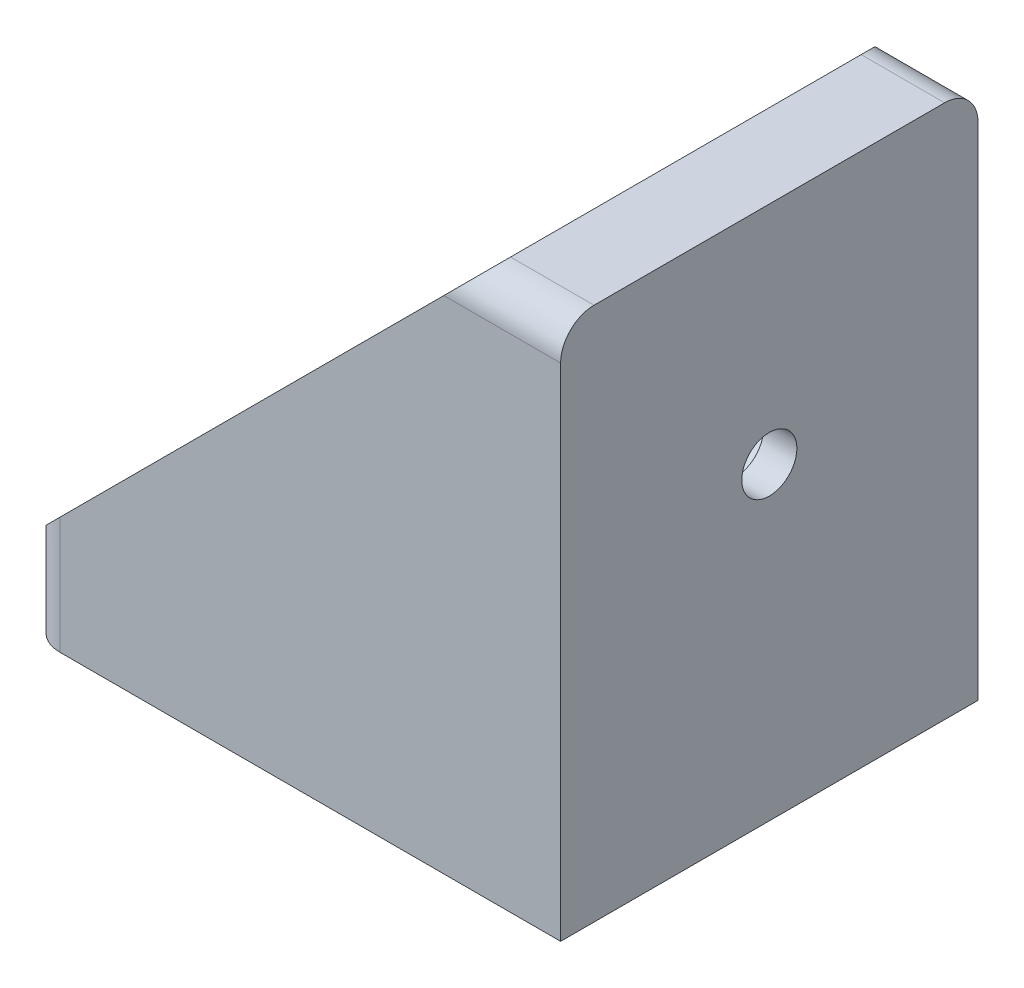
ISO-10303-21;
HEADER;
FILE_DESCRIPTION(('STEP AP214'),'2;1');
FILE_NAME('part.step','',(''),(''),'','','');
FILE_SCHEMA(('AUTOMOTIVE_DESIGN { 1 0 10303 214 1 1 1 1 }'));
ENDSEC;
DATA;
#1=APPLICATION_CONTEXT('core data for automotive mechanical design processes');
#2=APPLICATION_PROTOCOL_DEFINITION('international standard','automotive_design',2000,#1);
#3=PRODUCT_CONTEXT('',#1,'mechanical');
#4=PRODUCT('Part','Part','',(#3));
#5=PRODUCT_RELATED_PRODUCT_CATEGORY('part','',(#4));
#6=PRODUCT_DEFINITION_FORMATION('','',#4);
#7=PRODUCT_DEFINITION_CONTEXT('part definition',#1,'design');
#8=PRODUCT_DEFINITION('design','',#6,#7);
#9=PRODUCT_DEFINITION_SHAPE('','',#8);
#10=(LENGTH_UNIT() NAMED_UNIT(*) SI_UNIT(.MILLI.,.METRE.));
#11=(NAMED_UNIT(*) PLANE_ANGLE_UNIT() SI_UNIT($,.RADIAN.));
#12=(NAMED_UNIT(*) SI_UNIT($,.STERADIAN.) SOLID_ANGLE_UNIT());
#13=UNCERTAINTY_MEASURE_WITH_UNIT(LENGTH_MEASURE(1.E-05),#10,'distance_accuracy_value','');
#14=(GEOMETRIC_REPRESENTATION_CONTEXT(3) GLOBAL_UNCERTAINTY_ASSIGNED_CONTEXT((#13)) GLOBAL_UNIT_ASSIGNED_CONTEXT((#10,
#11,#12)) REPRESENTATION_CONTEXT('',''));
#15=CARTESIAN_POINT('',(0.,0.,0.));
#16=DIRECTION('',(0.,0.,1.));
#17=DIRECTION('',(1.,0.,0.));
#18=AXIS2_PLACEMENT_3D('',#15,#16,#17);
#19=CARTESIAN_POINT('',(-5.,5.,25.));
#20=DIRECTION('',(1.,0.,0.));
#21=DIRECTION('',(0.,1.,0.));
#22=AXIS2_PLACEMENT_3D('',#19,#20,#21);
#23=PLANE('',#22);
#24=DIRECTION('',(0.,0.5,0.866025403784438));
#25=VECTOR('',#24,1.);
#26=CARTESIAN_POINT('',(-5.,15.0358983848622,12.5));
#27=LINE('',#26,#25);
#28=CARTESIAN_POINT('',(-5.,15.0358983848622,12.5));
#29=VERTEX_POINT('',#28);
#30=CARTESIAN_POINT('',(-5.,16.7679491924311,15.5));
#31=VERTEX_POINT('',#30);
#32=EDGE_CURVE('E240',#29,#31,#27,.T.);
#33=ORIENTED_EDGE('',*,*,#32,.F.);
#34=DIRECTION('',(0.,-0.5,0.866025403784439));
#35=VECTOR('',#34,1.);
#36=CARTESIAN_POINT('',(-5.,16.7679491924311,9.5));
#37=LINE('',#36,#35);
#38=CARTESIAN_POINT('',(-5.,16.7679491924311,9.5));
#39=VERTEX_POINT('',#38);
#40=EDGE_CURVE('E57',#39,#29,#37,.T.);
#41=ORIENTED_EDGE('',*,*,#40,.F.);
#42=DIRECTION('',(0.,-1.,0.));
#43=VECTOR('',#42,1.);
#44=CARTESIAN_POINT('',(-5.,20.2320508075689,9.5));
#45=LINE('',#44,#43);
#46=CARTESIAN_POINT('',(-5.,20.2320508075689,9.5));
#47=VERTEX_POINT('',#46);
#48=EDGE_CURVE('E223',#47,#39,#45,.T.);
#49=ORIENTED_EDGE('',*,*,#48,.F.);
#50=DIRECTION('',(0.,-0.5,-0.866025403784438));
#51=VECTOR('',#50,1.);
#52=CARTESIAN_POINT('',(-5.,21.9641016151378,12.5));
#53=LINE('',#52,#51);
#54=CARTESIAN_POINT('',(-5.,21.9641016151378,12.5));
#55=VERTEX_POINT('',#54);
#56=EDGE_CURVE('E226',#55,#47,#53,.T.);
#57=ORIENTED_EDGE('',*,*,#56,.F.);
#58=DIRECTION('',(0.,0.5,-0.866025403784439));
#59=VECTOR('',#58,1.);
#60=CARTESIAN_POINT('',(-5.,20.2320508075689,15.5));
#61=LINE('',#60,#59);
#62=CARTESIAN_POINT('',(-5.,20.2320508075689,15.5));
#63=VERTEX_POINT('',#62);
#64=EDGE_CURVE('E246',#63,#55,#61,.T.);
#65=ORIENTED_EDGE('',*,*,#64,.F.);
#66=DIRECTION('',(0.,1.,0.));
#67=VECTOR('',#66,1.);
#68=CARTESIAN_POINT('',(-5.,16.7679491924311,15.5));
#69=LINE('',#68,#67);
#70=EDGE_CURVE('E243',#31,#63,#69,.T.);
#71=ORIENTED_EDGE('',*,*,#70,.F.);
#72=EDGE_LOOP('',(#33,#41,#49,#57,#65,#71));
#73=FACE_BOUND('',#72,.T.);
#74=DIRECTION('',(0.,1.,0.));
#75=VECTOR('',#74,1.);
#76=CARTESIAN_POINT('',(-5.,5.,3.));
#77=LINE('',#76,#75);
#78=CARTESIAN_POINT('',(-5.,5.,3.));
#79=VERTEX_POINT('',#78);
#80=CARTESIAN_POINT('',(-5.,32.,3.));
#81=VERTEX_POINT('',#80);
#82=EDGE_CURVE('E320',#79,#81,#77,.T.);
#83=ORIENTED_EDGE('',*,*,#82,.F.);
#84=DIRECTION('',(0.,0.,-1.));
#85=VECTOR('',#84,1.);
#86=CARTESIAN_POINT('',(-5.,5.,25.));
#87=LINE('',#86,#85);
#88=CARTESIAN_POINT('',(-5.,5.,22.));
#89=VERTEX_POINT('',#88);
#90=EDGE_CURVE('E353',#89,#79,#87,.T.);
#91=ORIENTED_EDGE('',*,*,#90,.F.);
#92=DIRECTION('',(0.,-1.,0.));
#93=VECTOR('',#92,1.);
#94=CARTESIAN_POINT('',(-5.,5.,22.));
#95=LINE('',#94,#93);
#96=CARTESIAN_POINT('',(-5.,32.,22.));
#97=VERTEX_POINT('',#96);
#98=EDGE_CURVE('E332',#97,#89,#95,.T.);
#99=ORIENTED_EDGE('',*,*,#98,.F.);
#100=DIRECTION('',(0.,0.,-1.));
#101=VECTOR('',#100,1.);
#102=CARTESIAN_POINT('',(-5.,32.,25.));
#103=LINE('',#102,#101);
#104=EDGE_CURVE('E356',#97,#81,#103,.T.);
#105=ORIENTED_EDGE('',*,*,#104,.T.);
#106=EDGE_LOOP('',(#83,#91,#99,#105));
#107=FACE_BOUND('',#106,.T.);
#108=ADVANCED_FACE('F40',(#73,#107),#23,.F.);
#109=CARTESIAN_POINT('',(-32.,5.,25.));
#110=DIRECTION('',(0.,-1.,0.));
#111=DIRECTION('',(0.,0.,-1.));
#112=AXIS2_PLACEMENT_3D('',#109,#110,#111);
#113=PLANE('',#112);
#114=DIRECTION('',(-0.5,0.,-0.866025403784438));
#115=VECTOR('',#114,1.);
#116=CARTESIAN_POINT('',(-15.0358983848622,5.,12.5));
#117=LINE('',#116,#115);
#118=CARTESIAN_POINT('',(-15.0358983848622,5.,12.5));
#119=VERTEX_POINT('',#118);
#120=CARTESIAN_POINT('',(-16.7679491924311,5.,9.5));
#121=VERTEX_POINT('',#120);
#122=EDGE_CURVE('E281',#119,#121,#117,.T.);
#123=ORIENTED_EDGE('',*,*,#122,.F.);
#124=DIRECTION('',(0.5,0.,-0.866025403784439));
#125=VECTOR('',#124,1.);
#126=CARTESIAN_POINT('',(-16.7679491924311,5.,15.5));
#127=LINE('',#126,#125);
#128=CARTESIAN_POINT('',(-16.7679491924311,5.,15.5));
#129=VERTEX_POINT('',#128);
#130=EDGE_CURVE('E65',#129,#119,#127,.T.);
#131=ORIENTED_EDGE('',*,*,#130,.F.);
#132=DIRECTION('',(1.,0.,0.));
#133=VECTOR('',#132,1.);
#134=CARTESIAN_POINT('',(-20.2320508075689,5.,15.5));
#135=LINE('',#134,#133);
#136=CARTESIAN_POINT('',(-20.2320508075689,5.,15.5));
#137=VERTEX_POINT('',#136);
#138=EDGE_CURVE('E264',#137,#129,#135,.T.);
#139=ORIENTED_EDGE('',*,*,#138,.F.);
#140=DIRECTION('',(0.5,0.,0.866025403784438));
#141=VECTOR('',#140,1.);
#142=CARTESIAN_POINT('',(-21.9641016151377,5.,12.5));
#143=LINE('',#142,#141);
#144=CARTESIAN_POINT('',(-21.9641016151377,5.,12.5));
#145=VERTEX_POINT('',#144);
#146=EDGE_CURVE('E290',#145,#137,#143,.T.);
#147=ORIENTED_EDGE('',*,*,#146,.F.);
#148=DIRECTION('',(-0.5,0.,0.866025403784438));
#149=VECTOR('',#148,1.);
#150=CARTESIAN_POINT('',(-20.2320508075689,5.,9.5));
#151=LINE('',#150,#149);
#152=CARTESIAN_POINT('',(-20.2320508075689,5.,9.5));
#153=VERTEX_POINT('',#152);
#154=EDGE_CURVE('E287',#153,#145,#151,.T.);
#155=ORIENTED_EDGE('',*,*,#154,.F.);
#156=DIRECTION('',(-1.,0.,0.));
#157=VECTOR('',#156,1.);
#158=CARTESIAN_POINT('',(-16.7679491924311,5.,9.5));
#159=LINE('',#158,#157);
#160=EDGE_CURVE('E284',#121,#153,#159,.T.);
#161=ORIENTED_EDGE('',*,*,#160,.F.);
#162=EDGE_LOOP('',(#123,#131,#139,#147,#155,#161));
#163=FACE_BOUND('',#162,.T.);
#164=DIRECTION('',(1.,0.,0.));
#165=VECTOR('',#164,1.);
#166=CARTESIAN_POINT('',(-32.,5.,3.));
#167=LINE('',#166,#165);
#168=CARTESIAN_POINT('',(-32.,5.,3.));
#169=VERTEX_POINT('',#168);
#170=EDGE_CURVE('E317',#169,#79,#167,.T.);
#171=ORIENTED_EDGE('',*,*,#170,.F.);
#172=DIRECTION('',(0.,0.,-1.));
#173=VECTOR('',#172,1.);
#174=CARTESIAN_POINT('',(-32.,5.,25.));
#175=LINE('',#174,#173);
#176=CARTESIAN_POINT('',(-32.,5.,22.));
#177=VERTEX_POINT('',#176);
#178=EDGE_CURVE('E350',#177,#169,#175,.T.);
#179=ORIENTED_EDGE('',*,*,#178,.F.);
#180=DIRECTION('',(-1.,0.,0.));
#181=VECTOR('',#180,1.);
#182=CARTESIAN_POINT('',(-32.,5.,22.));
#183=LINE('',#182,#181);
#184=EDGE_CURVE('E327',#89,#177,#183,.T.);
#185=ORIENTED_EDGE('',*,*,#184,.F.);
#186=ORIENTED_EDGE('',*,*,#90,.T.);
#187=EDGE_LOOP('',(#171,#179,#185,#186));
#188=FACE_BOUND('',#187,.T.);
#189=ADVANCED_FACE('F437',(#163,#188),#113,.F.);
#190=CARTESIAN_POINT('',(0.,32.,25.));
#191=DIRECTION('',(-1.,0.,0.));
#192=DIRECTION('',(0.,0.,1.));
#193=AXIS2_PLACEMENT_3D('',#190,#191,#192);
#194=PLANE('',#193);
#195=CARTESIAN_POINT('',(0.,18.5,12.5));
#196=DIRECTION('',(-1.,0.,0.));
#197=DIRECTION('',(0.,0.,1.));
#198=AXIS2_PLACEMENT_3D('',#195,#196,#197);
#199=CIRCLE('',#198,1.65);
#200=CARTESIAN_POINT('',(0.,18.5,14.15));
#201=VERTEX_POINT('',#200);
#202=EDGE_CURVE('E241',#201,#201,#199,.T.);
#203=ORIENTED_EDGE('',*,*,#202,.T.);
#204=EDGE_LOOP('',(#203));
#205=FACE_BOUND('',#204,.T.);
#206=DIRECTION('',(0.,1.,0.));
#207=VECTOR('',#206,1.);
#208=CARTESIAN_POINT('',(0.,32.,0.));
#209=LINE('',#208,#207);
#210=CARTESIAN_POINT('',(0.,0.,0.));
#211=VERTEX_POINT('',#210);
#212=CARTESIAN_POINT('',(0.,30.,0.));
#213=VERTEX_POINT('',#212);
#214=EDGE_CURVE('E334',#211,#213,#209,.T.);
#215=ORIENTED_EDGE('',*,*,#214,.T.);
#216=CARTESIAN_POINT('',(0.,30.,2.));
#217=DIRECTION('',(-1.,0.,0.));
#218=DIRECTION('',(0.,0.,1.));
#219=AXIS2_PLACEMENT_3D('',#216,#217,#218);
#220=CIRCLE('',#219,2.);
#221=CARTESIAN_POINT('',(0.,32.,2.));
#222=VERTEX_POINT('',#221);
#223=EDGE_CURVE('E377',#213,#222,#220,.F.);
#224=ORIENTED_EDGE('',*,*,#223,.T.);
#225=DIRECTION('',(0.,0.,-1.));
#226=VECTOR('',#225,1.);
#227=CARTESIAN_POINT('',(0.,32.,25.));
#228=LINE('',#227,#226);
#229=CARTESIAN_POINT('',(0.,32.,23.));
#230=VERTEX_POINT('',#229);
#231=EDGE_CURVE('E359',#230,#222,#228,.T.);
#232=ORIENTED_EDGE('',*,*,#231,.F.);
#233=CARTESIAN_POINT('',(0.,30.,23.));
#234=DIRECTION('',(-1.,0.,0.));
#235=DIRECTION('',(0.,0.,1.));
#236=AXIS2_PLACEMENT_3D('',#233,#234,#235);
#237=CIRCLE('',#236,2.);
#238=CARTESIAN_POINT('',(0.,30.,25.));
#239=VERTEX_POINT('',#238);
#240=EDGE_CURVE('E375',#230,#239,#237,.F.);
#241=ORIENTED_EDGE('',*,*,#240,.T.);
#242=DIRECTION('',(0.,1.,0.));
#243=VECTOR('',#242,1.);
#244=CARTESIAN_POINT('',(0.,32.,25.));
#245=LINE('',#244,#243);
#246=CARTESIAN_POINT('',(0.,0.,25.));
#247=VERTEX_POINT('',#246);
#248=EDGE_CURVE('E335',#247,#239,#245,.T.);
#249=ORIENTED_EDGE('',*,*,#248,.F.);
#250=DIRECTION('',(0.,0.,-1.));
#251=VECTOR('',#250,1.);
#252=CARTESIAN_POINT('',(0.,0.,25.));
#253=LINE('',#252,#251);
#254=EDGE_CURVE('E341',#247,#211,#253,.T.);
#255=ORIENTED_EDGE('',*,*,#254,.T.);
#256=EDGE_LOOP('',(#215,#224,#232,#241,#249,#255));
#257=FACE_BOUND('',#256,.T.);
#258=ADVANCED_FACE('F440',(#205,#257),#194,.F.);
#259=CARTESIAN_POINT('',(-5.,32.,25.));
#260=DIRECTION('',(0.,-1.,0.));
#261=DIRECTION('',(0.,0.,-1.));
#262=AXIS2_PLACEMENT_3D('',#259,#260,#261);
#263=PLANE('',#262);
#264=ORIENTED_EDGE('',*,*,#231,.T.);
#265=DIRECTION('',(-1.,0.,0.));
#266=VECTOR('',#265,1.);
#267=CARTESIAN_POINT('',(-5.,32.,2.));
#268=LINE('',#267,#266);
#269=CARTESIAN_POINT('',(-5.,32.,2.));
#270=VERTEX_POINT('',#269);
#271=EDGE_CURVE('E364',#222,#270,#268,.T.);
#272=ORIENTED_EDGE('',*,*,#271,.T.);
#273=DIRECTION('',(0.,0.,-1.));
#274=VECTOR('',#273,1.);
#275=CARTESIAN_POINT('',(-5.,32.,25.));
#276=LINE('',#275,#274);
#277=EDGE_CURVE('E314',#81,#270,#276,.T.);
#278=ORIENTED_EDGE('',*,*,#277,.F.);
#279=ORIENTED_EDGE('',*,*,#104,.F.);
#280=CARTESIAN_POINT('',(-5.,32.,23.));
#281=VERTEX_POINT('',#280);
#282=EDGE_CURVE('E357',#281,#97,#103,.T.);
#283=ORIENTED_EDGE('',*,*,#282,.F.);
#284=DIRECTION('',(-1.,0.,0.));
#285=VECTOR('',#284,1.);
#286=CARTESIAN_POINT('',(-5.,32.,23.));
#287=LINE('',#286,#285);
#288=EDGE_CURVE('E362',#281,#230,#287,.F.);
#289=ORIENTED_EDGE('',*,*,#288,.T.);
#290=EDGE_LOOP('',(#264,#272,#278,#279,#283,#289));
#291=FACE_BOUND('',#290,.T.);
#292=ADVANCED_FACE('F487',(#291),#263,.F.);
#293=CARTESIAN_POINT('',(-32.,0.,25.));
#294=DIRECTION('',(1.,0.,0.));
#295=DIRECTION('',(0.,0.,-1.));
#296=AXIS2_PLACEMENT_3D('',#293,#294,#295);
#297=PLANE('',#296);
#298=DIRECTION('',(0.,0.,1.));
#299=VECTOR('',#298,1.);
#300=CARTESIAN_POINT('',(-32.,5.,25.));
#301=LINE('',#300,#299);
#302=CARTESIAN_POINT('',(-32.,5.,2.));
#303=VERTEX_POINT('',#302);
#304=EDGE_CURVE('E310',#303,#169,#301,.T.);
#305=ORIENTED_EDGE('',*,*,#304,.F.);
#306=DIRECTION('',(0.,-1.,0.));
#307=VECTOR('',#306,1.);
#308=CARTESIAN_POINT('',(-32.,0.,2.));
#309=LINE('',#308,#307);
#310=CARTESIAN_POINT('',(-32.,0.,2.));
#311=VERTEX_POINT('',#310);
#312=EDGE_CURVE('E391',#303,#311,#309,.T.);
#313=ORIENTED_EDGE('',*,*,#312,.T.);
#314=DIRECTION('',(0.,0.,-1.));
#315=VECTOR('',#314,1.);
#316=CARTESIAN_POINT('',(-32.,0.,25.));
#317=LINE('',#316,#315);
#318=CARTESIAN_POINT('',(-32.,0.,23.));
#319=VERTEX_POINT('',#318);
#320=EDGE_CURVE('E347',#319,#311,#317,.T.);
#321=ORIENTED_EDGE('',*,*,#320,.F.);
#322=DIRECTION('',(0.,-1.,0.));
#323=VECTOR('',#322,1.);
#324=CARTESIAN_POINT('',(-32.,0.,23.));
#325=LINE('',#324,#323);
#326=CARTESIAN_POINT('',(-32.,5.,23.));
#327=VERTEX_POINT('',#326);
#328=EDGE_CURVE('E389',#319,#327,#325,.F.);
#329=ORIENTED_EDGE('',*,*,#328,.T.);
#330=EDGE_CURVE('E351',#327,#177,#175,.T.);
#331=ORIENTED_EDGE('',*,*,#330,.T.);
#332=ORIENTED_EDGE('',*,*,#178,.T.);
#333=EDGE_LOOP('',(#305,#313,#321,#329,#331,#332));
#334=FACE_BOUND('',#333,.T.);
#335=ADVANCED_FACE('F451',(#334),#297,.F.);
#336=CARTESIAN_POINT('',(0.,0.,25.));
#337=DIRECTION('',(0.,1.,0.));
#338=DIRECTION('',(-1.,0.,0.));
#339=AXIS2_PLACEMENT_3D('',#336,#337,#338);
#340=PLANE('',#339);
#341=CARTESIAN_POINT('',(-18.5,0.,12.5));
#342=DIRECTION('',(0.,1.,0.));
#343=DIRECTION('',(-1.,0.,0.));
#344=AXIS2_PLACEMENT_3D('',#341,#342,#343);
#345=CIRCLE('',#344,1.65);
#346=CARTESIAN_POINT('',(-20.15,0.,12.5));
#347=VERTEX_POINT('',#346);
#348=EDGE_CURVE('E44',#347,#347,#345,.T.);
#349=ORIENTED_EDGE('',*,*,#348,.T.);
#350=EDGE_LOOP('',(#349));
#351=FACE_BOUND('',#350,.T.);
#352=ORIENTED_EDGE('',*,*,#320,.T.);
#353=CARTESIAN_POINT('',(-30.,0.,2.));
#354=DIRECTION('',(0.,1.,0.));
#355=DIRECTION('',(-1.,0.,0.));
#356=AXIS2_PLACEMENT_3D('',#353,#354,#355);
#357=CIRCLE('',#356,2.);
#358=CARTESIAN_POINT('',(-30.,0.,0.));
#359=VERTEX_POINT('',#358);
#360=EDGE_CURVE('E11',#311,#359,#357,.F.);
#361=ORIENTED_EDGE('',*,*,#360,.T.);
#362=DIRECTION('',(1.,0.,0.));
#363=VECTOR('',#362,1.);
#364=CARTESIAN_POINT('',(0.,0.,0.));
#365=LINE('',#364,#363);
#366=EDGE_CURVE('E339',#359,#211,#365,.T.);
#367=ORIENTED_EDGE('',*,*,#366,.T.);
#368=ORIENTED_EDGE('',*,*,#254,.F.);
#369=DIRECTION('',(1.,0.,0.));
#370=VECTOR('',#369,1.);
#371=CARTESIAN_POINT('',(0.,0.,25.));
#372=LINE('',#371,#370);
#373=CARTESIAN_POINT('',(-30.,0.,25.));
#374=VERTEX_POINT('',#373);
#375=EDGE_CURVE('E338',#374,#247,#372,.T.);
#376=ORIENTED_EDGE('',*,*,#375,.F.);
#377=CARTESIAN_POINT('',(-30.,0.,23.));
#378=DIRECTION('',(0.,1.,0.));
#379=DIRECTION('',(-1.,0.,0.));
#380=AXIS2_PLACEMENT_3D('',#377,#378,#379);
#381=CIRCLE('',#380,2.);
#382=EDGE_CURVE('E49',#374,#319,#381,.F.);
#383=ORIENTED_EDGE('',*,*,#382,.T.);
#384=EDGE_LOOP('',(#352,#361,#367,#368,#376,#383));
#385=FACE_BOUND('',#384,.T.);
#386=ADVANCED_FACE('F465',(#351,#385),#340,.F.);
#387=CARTESIAN_POINT('',(0.,0.,25.));
#388=DIRECTION('',(0.,0.,-1.));
#389=DIRECTION('',(-1.,0.,0.));
#390=AXIS2_PLACEMENT_3D('',#387,#388,#389);
#391=PLANE('',#390);
#392=ORIENTED_EDGE('',*,*,#248,.T.);
#393=DIRECTION('',(-1.,0.,0.));
#394=VECTOR('',#393,1.);
#395=CARTESIAN_POINT('',(0.,30.,25.));
#396=LINE('',#395,#394);
#397=CARTESIAN_POINT('',(-7.,30.,25.));
#398=VERTEX_POINT('',#397);
#399=EDGE_CURVE('E382',#239,#398,#396,.T.);
#400=ORIENTED_EDGE('',*,*,#399,.T.);
#401=DIRECTION('',(0.707106781186547,0.707106781186548,0.));
#402=VECTOR('',#401,1.);
#403=CARTESIAN_POINT('',(-32.,5.,25.));
#404=LINE('',#403,#402);
#405=CARTESIAN_POINT('',(-30.,7.,25.));
#406=VERTEX_POINT('',#405);
#407=EDGE_CURVE('E324',#406,#398,#404,.T.);
#408=ORIENTED_EDGE('',*,*,#407,.F.);
#409=DIRECTION('',(0.,-1.,0.));
#410=VECTOR('',#409,1.);
#411=CARTESIAN_POINT('',(-30.,0.,25.));
#412=LINE('',#411,#410);
#413=EDGE_CURVE('E379',#406,#374,#412,.T.);
#414=ORIENTED_EDGE('',*,*,#413,.T.);
#415=ORIENTED_EDGE('',*,*,#375,.T.);
#416=EDGE_LOOP('',(#392,#400,#408,#414,#415));
#417=FACE_BOUND('',#416,.T.);
#418=ADVANCED_FACE('F474',(#417),#391,.F.);
#419=CARTESIAN_POINT('',(0.,0.,0.));
#420=DIRECTION('',(0.,0.,-1.));
#421=DIRECTION('',(-1.,0.,0.));
#422=AXIS2_PLACEMENT_3D('',#419,#420,#421);
#423=PLANE('',#422);
#424=DIRECTION('',(0.707106781186547,0.707106781186548,0.));
#425=VECTOR('',#424,1.);
#426=CARTESIAN_POINT('',(-32.,5.,0.));
#427=LINE('',#426,#425);
#428=CARTESIAN_POINT('',(-30.,7.,0.));
#429=VERTEX_POINT('',#428);
#430=CARTESIAN_POINT('',(-7.,30.,0.));
#431=VERTEX_POINT('',#430);
#432=EDGE_CURVE('E307',#429,#431,#427,.T.);
#433=ORIENTED_EDGE('',*,*,#432,.T.);
#434=DIRECTION('',(-1.,0.,0.));
#435=VECTOR('',#434,1.);
#436=CARTESIAN_POINT('',(0.,30.,0.));
#437=LINE('',#436,#435);
#438=EDGE_CURVE('E373',#431,#213,#437,.F.);
#439=ORIENTED_EDGE('',*,*,#438,.T.);
#440=ORIENTED_EDGE('',*,*,#214,.F.);
#441=ORIENTED_EDGE('',*,*,#366,.F.);
#442=DIRECTION('',(0.,-1.,0.));
#443=VECTOR('',#442,1.);
#444=CARTESIAN_POINT('',(-30.,5.,0.));
#445=LINE('',#444,#443);
#446=EDGE_CURVE('E371',#359,#429,#445,.F.);
#447=ORIENTED_EDGE('',*,*,#446,.T.);
#448=EDGE_LOOP('',(#433,#439,#440,#441,#447));
#449=FACE_BOUND('',#448,.T.);
#450=ADVANCED_FACE('F496',(#449),#423,.T.);
#451=CARTESIAN_POINT('',(-16.,16.,22.));
#452=DIRECTION('',(0.,0.,1.));
#453=DIRECTION('',(1.,0.,0.));
#454=AXIS2_PLACEMENT_3D('',#451,#452,#453);
#455=PLANE('',#454);
#456=DIRECTION('',(0.707106781186547,0.707106781186548,0.));
#457=VECTOR('',#456,1.);
#458=CARTESIAN_POINT('',(-32.,5.,22.));
#459=LINE('',#458,#457);
#460=EDGE_CURVE('E323',#177,#97,#459,.T.);
#461=ORIENTED_EDGE('',*,*,#460,.T.);
#462=ORIENTED_EDGE('',*,*,#98,.T.);
#463=ORIENTED_EDGE('',*,*,#184,.T.);
#464=EDGE_LOOP('',(#461,#462,#463));
#465=FACE_BOUND('',#464,.T.);
#466=ADVANCED_FACE('F482',(#465),#455,.F.);
#467=CARTESIAN_POINT('',(-32.,5.,25.));
#468=DIRECTION('',(0.707106781186548,-0.707106781186547,0.));
#469=DIRECTION('',(0.707106781186547,0.707106781186548,0.));
#470=AXIS2_PLACEMENT_3D('',#467,#468,#469);
#471=PLANE('',#470);
#472=ORIENTED_EDGE('',*,*,#407,.T.);
#473=CARTESIAN_POINT('',(-7.,30.,23.));
#474=DIRECTION('',(0.707106781186548,-0.707106781186547,0.));
#475=DIRECTION('',(-0.707106781186547,-0.707106781186548,0.));
#476=AXIS2_PLACEMENT_3D('',#473,#474,#475);
#477=ELLIPSE('',#476,2.82842712474619,2.);
#478=EDGE_CURVE('E387',#398,#281,#477,.F.);
#479=ORIENTED_EDGE('',*,*,#478,.T.);
#480=ORIENTED_EDGE('',*,*,#282,.T.);
#481=ORIENTED_EDGE('',*,*,#460,.F.);
#482=ORIENTED_EDGE('',*,*,#330,.F.);
#483=CARTESIAN_POINT('',(-30.,7.,23.));
#484=DIRECTION('',(0.707106781186548,-0.707106781186547,0.));
#485=DIRECTION('',(-0.707106781186547,-0.707106781186548,0.));
#486=AXIS2_PLACEMENT_3D('',#483,#484,#485);
#487=ELLIPSE('',#486,2.82842712474619,2.);
#488=EDGE_CURVE('E385',#327,#406,#487,.F.);
#489=ORIENTED_EDGE('',*,*,#488,.T.);
#490=EDGE_LOOP('',(#472,#479,#480,#481,#482,#489));
#491=FACE_BOUND('',#490,.T.);
#492=ADVANCED_FACE('F477',(#491),#471,.F.);
#493=CARTESIAN_POINT('',(-16.,16.,3.));
#494=DIRECTION('',(0.,0.,-1.));
#495=DIRECTION('',(-1.,0.,0.));
#496=AXIS2_PLACEMENT_3D('',#493,#494,#495);
#497=PLANE('',#496);
#498=ORIENTED_EDGE('',*,*,#170,.T.);
#499=ORIENTED_EDGE('',*,*,#82,.T.);
#500=DIRECTION('',(0.707106781186547,0.707106781186548,0.));
#501=VECTOR('',#500,1.);
#502=CARTESIAN_POINT('',(-32.,5.,3.));
#503=LINE('',#502,#501);
#504=EDGE_CURVE('E297',#169,#81,#503,.T.);
#505=ORIENTED_EDGE('',*,*,#504,.F.);
#506=EDGE_LOOP('',(#498,#499,#505));
#507=FACE_BOUND('',#506,.T.);
#508=ADVANCED_FACE('F454',(#507),#497,.F.);
#509=CARTESIAN_POINT('',(-32.,5.,0.));
#510=DIRECTION('',(-0.707106781186548,0.707106781186547,0.));
#511=DIRECTION('',(0.707106781186547,0.707106781186548,0.));
#512=AXIS2_PLACEMENT_3D('',#509,#510,#511);
#513=PLANE('',#512);
#514=ORIENTED_EDGE('',*,*,#277,.T.);
#515=CARTESIAN_POINT('',(-7.,30.,2.));
#516=DIRECTION('',(-0.707106781186548,0.707106781186547,0.));
#517=DIRECTION('',(0.707106781186547,0.707106781186548,0.));
#518=AXIS2_PLACEMENT_3D('',#515,#516,#517);
#519=ELLIPSE('',#518,2.82842712474619,2.);
#520=EDGE_CURVE('E369',#270,#431,#519,.T.);
#521=ORIENTED_EDGE('',*,*,#520,.T.);
#522=ORIENTED_EDGE('',*,*,#432,.F.);
#523=CARTESIAN_POINT('',(-30.,7.,2.));
#524=DIRECTION('',(-0.707106781186548,0.707106781186547,0.));
#525=DIRECTION('',(0.707106781186547,0.707106781186548,0.));
#526=AXIS2_PLACEMENT_3D('',#523,#524,#525);
#527=ELLIPSE('',#526,2.82842712474619,2.);
#528=EDGE_CURVE('E367',#429,#303,#527,.T.);
#529=ORIENTED_EDGE('',*,*,#528,.T.);
#530=ORIENTED_EDGE('',*,*,#304,.T.);
#531=ORIENTED_EDGE('',*,*,#504,.T.);
#532=EDGE_LOOP('',(#514,#521,#522,#529,#530,#531));
#533=FACE_BOUND('',#532,.T.);
#534=ADVANCED_FACE('F456',(#533),#513,.T.);
#535=CARTESIAN_POINT('',(-5.,30.,2.));
#536=DIRECTION('',(1.,0.,0.));
#537=DIRECTION('',(0.,0.,-1.));
#538=AXIS2_PLACEMENT_3D('',#535,#536,#537);
#539=CYLINDRICAL_SURFACE('',#538,2.);
#540=ORIENTED_EDGE('',*,*,#223,.F.);
#541=ORIENTED_EDGE('',*,*,#438,.F.);
#542=ORIENTED_EDGE('',*,*,#520,.F.);
#543=ORIENTED_EDGE('',*,*,#271,.F.);
#544=EDGE_LOOP('',(#540,#541,#542,#543));
#545=FACE_BOUND('',#544,.T.);
#546=ADVANCED_FACE('F493',(#545),#539,.T.);
#547=CARTESIAN_POINT('',(0.,30.,23.));
#548=DIRECTION('',(-1.,0.,0.));
#549=DIRECTION('',(0.,0.,1.));
#550=AXIS2_PLACEMENT_3D('',#547,#548,#549);
#551=CYLINDRICAL_SURFACE('',#550,2.);
#552=ORIENTED_EDGE('',*,*,#240,.F.);
#553=ORIENTED_EDGE('',*,*,#288,.F.);
#554=ORIENTED_EDGE('',*,*,#478,.F.);
#555=ORIENTED_EDGE('',*,*,#399,.F.);
#556=EDGE_LOOP('',(#552,#553,#554,#555));
#557=FACE_BOUND('',#556,.T.);
#558=ADVANCED_FACE('F502',(#557),#551,.T.);
#559=CARTESIAN_POINT('',(-30.,0.,2.));
#560=DIRECTION('',(0.,1.,0.));
#561=DIRECTION('',(0.,0.,1.));
#562=AXIS2_PLACEMENT_3D('',#559,#560,#561);
#563=CYLINDRICAL_SURFACE('',#562,2.);
#564=ORIENTED_EDGE('',*,*,#528,.F.);
#565=ORIENTED_EDGE('',*,*,#446,.F.);
#566=ORIENTED_EDGE('',*,*,#360,.F.);
#567=ORIENTED_EDGE('',*,*,#312,.F.);
#568=EDGE_LOOP('',(#564,#565,#566,#567));
#569=FACE_BOUND('',#568,.T.);
#570=ADVANCED_FACE('F461',(#569),#563,.T.);
#571=CARTESIAN_POINT('',(-30.,0.,23.));
#572=DIRECTION('',(0.,-1.,0.));
#573=DIRECTION('',(0.,0.,-1.));
#574=AXIS2_PLACEMENT_3D('',#571,#572,#573);
#575=CYLINDRICAL_SURFACE('',#574,2.);
#576=ORIENTED_EDGE('',*,*,#488,.F.);
#577=ORIENTED_EDGE('',*,*,#328,.F.);
#578=ORIENTED_EDGE('',*,*,#382,.F.);
#579=ORIENTED_EDGE('',*,*,#413,.F.);
#580=EDGE_LOOP('',(#576,#577,#578,#579));
#581=FACE_BOUND('',#580,.T.);
#582=ADVANCED_FACE('F42',(#581),#575,.T.);
#583=CARTESIAN_POINT('',(-16.7679491924311,2.,15.5));
#584=DIRECTION('',(0.866025403784439,0.,0.5));
#585=DIRECTION('',(0.5,0.,-0.866025403784439));
#586=AXIS2_PLACEMENT_3D('',#583,#584,#585);
#587=PLANE('',#586);
#588=ORIENTED_EDGE('',*,*,#130,.T.);
#589=DIRECTION('',(0.,1.,0.));
#590=VECTOR('',#589,1.);
#591=CARTESIAN_POINT('',(-15.0358983848622,2.,12.5));
#592=LINE('',#591,#590);
#593=CARTESIAN_POINT('',(-15.0358983848622,2.,12.5));
#594=VERTEX_POINT('',#593);
#595=EDGE_CURVE('E279',#594,#119,#592,.T.);
#596=ORIENTED_EDGE('',*,*,#595,.F.);
#597=DIRECTION('',(0.5,0.,-0.866025403784439));
#598=VECTOR('',#597,1.);
#599=CARTESIAN_POINT('',(-16.7679491924311,2.,15.5));
#600=LINE('',#599,#598);
#601=CARTESIAN_POINT('',(-16.7679491924311,2.,15.5));
#602=VERTEX_POINT('',#601);
#603=EDGE_CURVE('E260',#602,#594,#600,.T.);
#604=ORIENTED_EDGE('',*,*,#603,.F.);
#605=DIRECTION('',(0.,1.,0.));
#606=VECTOR('',#605,1.);
#607=CARTESIAN_POINT('',(-16.7679491924311,2.,15.5));
#608=LINE('',#607,#606);
#609=EDGE_CURVE('E295',#602,#129,#608,.T.);
#610=ORIENTED_EDGE('',*,*,#609,.T.);
#611=EDGE_LOOP('',(#588,#596,#604,#610));
#612=FACE_BOUND('',#611,.T.);
#613=ADVANCED_FACE('F418',(#612),#587,.F.);
#614=CARTESIAN_POINT('',(-20.2320508075689,2.,15.5));
#615=DIRECTION('',(0.,0.,1.));
#616=DIRECTION('',(1.,0.,0.));
#617=AXIS2_PLACEMENT_3D('',#614,#615,#616);
#618=PLANE('',#617);
#619=ORIENTED_EDGE('',*,*,#138,.T.);
#620=ORIENTED_EDGE('',*,*,#609,.F.);
#621=DIRECTION('',(1.,0.,0.));
#622=VECTOR('',#621,1.);
#623=CARTESIAN_POINT('',(-20.2320508075689,2.,15.5));
#624=LINE('',#623,#622);
#625=CARTESIAN_POINT('',(-20.2320508075689,2.,15.5));
#626=VERTEX_POINT('',#625);
#627=EDGE_CURVE('E276',#626,#602,#624,.T.);
#628=ORIENTED_EDGE('',*,*,#627,.F.);
#629=DIRECTION('',(0.,1.,0.));
#630=VECTOR('',#629,1.);
#631=CARTESIAN_POINT('',(-20.2320508075689,2.,15.5));
#632=LINE('',#631,#630);
#633=EDGE_CURVE('E298',#626,#137,#632,.T.);
#634=ORIENTED_EDGE('',*,*,#633,.T.);
#635=EDGE_LOOP('',(#619,#620,#628,#634));
#636=FACE_BOUND('',#635,.T.);
#637=ADVANCED_FACE('F435',(#636),#618,.F.);
#638=CARTESIAN_POINT('',(-21.9641016151377,2.,12.5));
#639=DIRECTION('',(-0.866025403784439,0.,0.5));
#640=DIRECTION('',(0.5,0.,0.866025403784439));
#641=AXIS2_PLACEMENT_3D('',#638,#639,#640);
#642=PLANE('',#641);
#643=ORIENTED_EDGE('',*,*,#146,.T.);
#644=ORIENTED_EDGE('',*,*,#633,.F.);
#645=DIRECTION('',(0.5,0.,0.866025403784438));
#646=VECTOR('',#645,1.);
#647=CARTESIAN_POINT('',(-21.9641016151377,2.,12.5));
#648=LINE('',#647,#646);
#649=CARTESIAN_POINT('',(-21.9641016151377,2.,12.5));
#650=VERTEX_POINT('',#649);
#651=EDGE_CURVE('E273',#650,#626,#648,.T.);
#652=ORIENTED_EDGE('',*,*,#651,.F.);
#653=DIRECTION('',(0.,1.,0.));
#654=VECTOR('',#653,1.);
#655=CARTESIAN_POINT('',(-21.9641016151377,2.,12.5));
#656=LINE('',#655,#654);
#657=EDGE_CURVE('E300',#650,#145,#656,.T.);
#658=ORIENTED_EDGE('',*,*,#657,.T.);
#659=EDGE_LOOP('',(#643,#644,#652,#658));
#660=FACE_BOUND('',#659,.T.);
#661=ADVANCED_FACE('F432',(#660),#642,.F.);
#662=CARTESIAN_POINT('',(-20.2320508075689,2.,9.5));
#663=DIRECTION('',(-0.866025403784439,0.,-0.5));
#664=DIRECTION('',(-0.5,0.,0.866025403784439));
#665=AXIS2_PLACEMENT_3D('',#662,#663,#664);
#666=PLANE('',#665);
#667=ORIENTED_EDGE('',*,*,#154,.T.);
#668=ORIENTED_EDGE('',*,*,#657,.F.);
#669=DIRECTION('',(-0.5,0.,0.866025403784438));
#670=VECTOR('',#669,1.);
#671=CARTESIAN_POINT('',(-20.2320508075689,2.,9.5));
#672=LINE('',#671,#670);
#673=CARTESIAN_POINT('',(-20.2320508075689,2.,9.5));
#674=VERTEX_POINT('',#673);
#675=EDGE_CURVE('E270',#674,#650,#672,.T.);
#676=ORIENTED_EDGE('',*,*,#675,.F.);
#677=DIRECTION('',(0.,1.,0.));
#678=VECTOR('',#677,1.);
#679=CARTESIAN_POINT('',(-20.2320508075689,2.,9.5));
#680=LINE('',#679,#678);
#681=EDGE_CURVE('E302',#674,#153,#680,.T.);
#682=ORIENTED_EDGE('',*,*,#681,.T.);
#683=EDGE_LOOP('',(#667,#668,#676,#682));
#684=FACE_BOUND('',#683,.T.);
#685=ADVANCED_FACE('F428',(#684),#666,.F.);
#686=CARTESIAN_POINT('',(-16.7679491924311,2.,9.5));
#687=DIRECTION('',(0.,0.,-1.));
#688=DIRECTION('',(-1.,0.,0.));
#689=AXIS2_PLACEMENT_3D('',#686,#687,#688);
#690=PLANE('',#689);
#691=ORIENTED_EDGE('',*,*,#160,.T.);
#692=ORIENTED_EDGE('',*,*,#681,.F.);
#693=DIRECTION('',(-1.,0.,0.));
#694=VECTOR('',#693,1.);
#695=CARTESIAN_POINT('',(-16.7679491924311,2.,9.5));
#696=LINE('',#695,#694);
#697=CARTESIAN_POINT('',(-16.7679491924311,2.,9.5));
#698=VERTEX_POINT('',#697);
#699=EDGE_CURVE('E267',#698,#674,#696,.T.);
#700=ORIENTED_EDGE('',*,*,#699,.F.);
#701=DIRECTION('',(0.,1.,0.));
#702=VECTOR('',#701,1.);
#703=CARTESIAN_POINT('',(-16.7679491924311,2.,9.5));
#704=LINE('',#703,#702);
#705=EDGE_CURVE('E304',#698,#121,#704,.T.);
#706=ORIENTED_EDGE('',*,*,#705,.T.);
#707=EDGE_LOOP('',(#691,#692,#700,#706));
#708=FACE_BOUND('',#707,.T.);
#709=ADVANCED_FACE('F424',(#708),#690,.F.);
#710=CARTESIAN_POINT('',(-15.0358983848622,2.,12.5));
#711=DIRECTION('',(0.866025403784438,0.,-0.5));
#712=DIRECTION('',(-0.5,0.,-0.866025403784438));
#713=AXIS2_PLACEMENT_3D('',#710,#711,#712);
#714=PLANE('',#713);
#715=ORIENTED_EDGE('',*,*,#122,.T.);
#716=ORIENTED_EDGE('',*,*,#705,.F.);
#717=DIRECTION('',(-0.5,0.,-0.866025403784438));
#718=VECTOR('',#717,1.);
#719=CARTESIAN_POINT('',(-15.0358983848622,2.,12.5));
#720=LINE('',#719,#718);
#721=EDGE_CURVE('E263',#594,#698,#720,.T.);
#722=ORIENTED_EDGE('',*,*,#721,.F.);
#723=ORIENTED_EDGE('',*,*,#595,.T.);
#724=EDGE_LOOP('',(#715,#716,#722,#723));
#725=FACE_BOUND('',#724,.T.);
#726=ADVANCED_FACE('F413',(#725),#714,.F.);
#727=CARTESIAN_POINT('',(0.,2.,0.));
#728=DIRECTION('',(0.,1.,0.));
#729=DIRECTION('',(0.,0.,1.));
#730=AXIS2_PLACEMENT_3D('',#727,#728,#729);
#731=PLANE('',#730);
#732=CARTESIAN_POINT('',(-18.5,2.,12.5));
#733=DIRECTION('',(0.,1.,0.));
#734=DIRECTION('',(0.,0.,1.));
#735=AXIS2_PLACEMENT_3D('',#732,#733,#734);
#736=CIRCLE('',#735,1.65);
#737=CARTESIAN_POINT('',(-18.5,2.,14.15));
#738=VERTEX_POINT('',#737);
#739=EDGE_CURVE('E401',#738,#738,#736,.T.);
#740=ORIENTED_EDGE('',*,*,#739,.F.);
#741=EDGE_LOOP('',(#740));
#742=FACE_BOUND('',#741,.T.);
#743=ORIENTED_EDGE('',*,*,#603,.T.);
#744=ORIENTED_EDGE('',*,*,#721,.T.);
#745=ORIENTED_EDGE('',*,*,#699,.T.);
#746=ORIENTED_EDGE('',*,*,#675,.T.);
#747=ORIENTED_EDGE('',*,*,#651,.T.);
#748=ORIENTED_EDGE('',*,*,#627,.T.);
#749=EDGE_LOOP('',(#743,#744,#745,#746,#747,#748));
#750=FACE_BOUND('',#749,.T.);
#751=ADVANCED_FACE('F410',(#742,#750),#731,.T.);
#752=CARTESIAN_POINT('',(-2.,16.7679491924311,9.5));
#753=DIRECTION('',(0.,-0.866025403784439,-0.5));
#754=DIRECTION('',(0.,0.5,-0.866025403784439));
#755=AXIS2_PLACEMENT_3D('',#752,#753,#754);
#756=PLANE('',#755);
#757=ORIENTED_EDGE('',*,*,#40,.T.);
#758=DIRECTION('',(-1.,0.,0.));
#759=VECTOR('',#758,1.);
#760=CARTESIAN_POINT('',(-2.,15.0358983848622,12.5));
#761=LINE('',#760,#759);
#762=CARTESIAN_POINT('',(-2.,15.0358983848622,12.5));
#763=VERTEX_POINT('',#762);
#764=EDGE_CURVE('E200',#763,#29,#761,.T.);
#765=ORIENTED_EDGE('',*,*,#764,.F.);
#766=DIRECTION('',(0.,-0.5,0.866025403784439));
#767=VECTOR('',#766,1.);
#768=CARTESIAN_POINT('',(-2.,16.7679491924311,9.5));
#769=LINE('',#768,#767);
#770=CARTESIAN_POINT('',(-2.,16.7679491924311,9.5));
#771=VERTEX_POINT('',#770);
#772=EDGE_CURVE('E204',#771,#763,#769,.T.);
#773=ORIENTED_EDGE('',*,*,#772,.F.);
#774=DIRECTION('',(-1.,0.,0.));
#775=VECTOR('',#774,1.);
#776=CARTESIAN_POINT('',(-2.,16.7679491924311,9.5));
#777=LINE('',#776,#775);
#778=EDGE_CURVE('E251',#771,#39,#777,.T.);
#779=ORIENTED_EDGE('',*,*,#778,.T.);
#780=EDGE_LOOP('',(#757,#765,#773,#779));
#781=FACE_BOUND('',#780,.T.);
#782=ADVANCED_FACE('F202',(#781),#756,.F.);
#783=CARTESIAN_POINT('',(-2.,20.2320508075689,9.5));
#784=DIRECTION('',(0.,0.,-1.));
#785=DIRECTION('',(-1.,0.,0.));
#786=AXIS2_PLACEMENT_3D('',#783,#784,#785);
#787=PLANE('',#786);
#788=ORIENTED_EDGE('',*,*,#48,.T.);
#789=ORIENTED_EDGE('',*,*,#778,.F.);
#790=DIRECTION('',(0.,-1.,0.));
#791=VECTOR('',#790,1.);
#792=CARTESIAN_POINT('',(-2.,20.2320508075689,9.5));
#793=LINE('',#792,#791);
#794=CARTESIAN_POINT('',(-2.,20.2320508075689,9.5));
#795=VERTEX_POINT('',#794);
#796=EDGE_CURVE('E210',#795,#771,#793,.T.);
#797=ORIENTED_EDGE('',*,*,#796,.F.);
#798=DIRECTION('',(-1.,0.,0.));
#799=VECTOR('',#798,1.);
#800=CARTESIAN_POINT('',(-2.,20.2320508075689,9.5));
#801=LINE('',#800,#799);
#802=EDGE_CURVE('E253',#795,#47,#801,.T.);
#803=ORIENTED_EDGE('',*,*,#802,.T.);
#804=EDGE_LOOP('',(#788,#789,#797,#803));
#805=FACE_BOUND('',#804,.T.);
#806=ADVANCED_FACE('F666',(#805),#787,.F.);
#807=CARTESIAN_POINT('',(-2.,21.9641016151378,12.5));
#808=DIRECTION('',(0.,0.866025403784438,-0.500000000000001));
#809=DIRECTION('',(0.,0.500000000000001,0.866025403784438));
#810=AXIS2_PLACEMENT_3D('',#807,#808,#809);
#811=PLANE('',#810);
#812=ORIENTED_EDGE('',*,*,#56,.T.);
#813=ORIENTED_EDGE('',*,*,#802,.F.);
#814=DIRECTION('',(0.,-0.5,-0.866025403784438));
#815=VECTOR('',#814,1.);
#816=CARTESIAN_POINT('',(-2.,21.9641016151378,12.5));
#817=LINE('',#816,#815);
#818=CARTESIAN_POINT('',(-2.,21.9641016151378,12.5));
#819=VERTEX_POINT('',#818);
#820=EDGE_CURVE('E236',#819,#795,#817,.T.);
#821=ORIENTED_EDGE('',*,*,#820,.F.);
#822=DIRECTION('',(-1.,0.,0.));
#823=VECTOR('',#822,1.);
#824=CARTESIAN_POINT('',(-2.,21.9641016151378,12.5));
#825=LINE('',#824,#823);
#826=EDGE_CURVE('E255',#819,#55,#825,.T.);
#827=ORIENTED_EDGE('',*,*,#826,.T.);
#828=EDGE_LOOP('',(#812,#813,#821,#827));
#829=FACE_BOUND('',#828,.T.);
#830=ADVANCED_FACE('F675',(#829),#811,.F.);
#831=CARTESIAN_POINT('',(-2.,20.2320508075689,15.5));
#832=DIRECTION('',(0.,0.866025403784439,0.5));
#833=DIRECTION('',(0.,-0.5,0.866025403784439));
#834=AXIS2_PLACEMENT_3D('',#831,#832,#833);
#835=PLANE('',#834);
#836=ORIENTED_EDGE('',*,*,#64,.T.);
#837=ORIENTED_EDGE('',*,*,#826,.F.);
#838=DIRECTION('',(0.,0.5,-0.866025403784439));
#839=VECTOR('',#838,1.);
#840=CARTESIAN_POINT('',(-2.,20.2320508075689,15.5));
#841=LINE('',#840,#839);
#842=CARTESIAN_POINT('',(-2.,20.2320508075689,15.5));
#843=VERTEX_POINT('',#842);
#844=EDGE_CURVE('E233',#843,#819,#841,.T.);
#845=ORIENTED_EDGE('',*,*,#844,.F.);
#846=DIRECTION('',(-1.,0.,0.));
#847=VECTOR('',#846,1.);
#848=CARTESIAN_POINT('',(-2.,20.2320508075689,15.5));
#849=LINE('',#848,#847);
#850=EDGE_CURVE('E257',#843,#63,#849,.T.);
#851=ORIENTED_EDGE('',*,*,#850,.T.);
#852=EDGE_LOOP('',(#836,#837,#845,#851));
#853=FACE_BOUND('',#852,.T.);
#854=ADVANCED_FACE('F685',(#853),#835,.F.);
#855=CARTESIAN_POINT('',(-2.,16.7679491924311,15.5));
#856=DIRECTION('',(0.,0.,1.));
#857=DIRECTION('',(1.,0.,0.));
#858=AXIS2_PLACEMENT_3D('',#855,#856,#857);
#859=PLANE('',#858);
#860=ORIENTED_EDGE('',*,*,#70,.T.);
#861=ORIENTED_EDGE('',*,*,#850,.F.);
#862=DIRECTION('',(0.,1.,0.));
#863=VECTOR('',#862,1.);
#864=CARTESIAN_POINT('',(-2.,16.7679491924311,15.5));
#865=LINE('',#864,#863);
#866=CARTESIAN_POINT('',(-2.,16.7679491924311,15.5));
#867=VERTEX_POINT('',#866);
#868=EDGE_CURVE('E218',#867,#843,#865,.T.);
#869=ORIENTED_EDGE('',*,*,#868,.F.);
#870=DIRECTION('',(-1.,0.,0.));
#871=VECTOR('',#870,1.);
#872=CARTESIAN_POINT('',(-2.,16.7679491924311,15.5));
#873=LINE('',#872,#871);
#874=EDGE_CURVE('E209',#867,#31,#873,.T.);
#875=ORIENTED_EDGE('',*,*,#874,.T.);
#876=EDGE_LOOP('',(#860,#861,#869,#875));
#877=FACE_BOUND('',#876,.T.);
#878=ADVANCED_FACE('F695',(#877),#859,.F.);
#879=CARTESIAN_POINT('',(-2.,15.0358983848622,12.5));
#880=DIRECTION('',(0.,-0.866025403784439,0.5));
#881=DIRECTION('',(0.,-0.5,-0.866025403784439));
#882=AXIS2_PLACEMENT_3D('',#879,#880,#881);
#883=PLANE('',#882);
#884=ORIENTED_EDGE('',*,*,#32,.T.);
#885=ORIENTED_EDGE('',*,*,#874,.F.);
#886=DIRECTION('',(0.,0.5,0.866025403784438));
#887=VECTOR('',#886,1.);
#888=CARTESIAN_POINT('',(-2.,15.0358983848622,12.5));
#889=LINE('',#888,#887);
#890=EDGE_CURVE('E213',#763,#867,#889,.T.);
#891=ORIENTED_EDGE('',*,*,#890,.F.);
#892=ORIENTED_EDGE('',*,*,#764,.T.);
#893=EDGE_LOOP('',(#884,#885,#891,#892));
#894=FACE_BOUND('',#893,.T.);
#895=ADVANCED_FACE('F214',(#894),#883,.F.);
#896=CARTESIAN_POINT('',(-2.,0.,0.));
#897=DIRECTION('',(-1.,0.,0.));
#898=DIRECTION('',(0.,0.,1.));
#899=AXIS2_PLACEMENT_3D('',#896,#897,#898);
#900=PLANE('',#899);
#901=CARTESIAN_POINT('',(-2.,18.5,12.5));
#902=DIRECTION('',(-1.,0.,0.));
#903=DIRECTION('',(0.,0.,1.));
#904=AXIS2_PLACEMENT_3D('',#901,#902,#903);
#905=CIRCLE('',#904,1.65);
#906=CARTESIAN_POINT('',(-2.,18.5,14.15));
#907=VERTEX_POINT('',#906);
#908=EDGE_CURVE('E229',#907,#907,#905,.T.);
#909=ORIENTED_EDGE('',*,*,#908,.F.);
#910=EDGE_LOOP('',(#909));
#911=FACE_BOUND('',#910,.T.);
#912=ORIENTED_EDGE('',*,*,#772,.T.);
#913=ORIENTED_EDGE('',*,*,#890,.T.);
#914=ORIENTED_EDGE('',*,*,#868,.T.);
#915=ORIENTED_EDGE('',*,*,#844,.T.);
#916=ORIENTED_EDGE('',*,*,#820,.T.);
#917=ORIENTED_EDGE('',*,*,#796,.T.);
#918=EDGE_LOOP('',(#912,#913,#914,#915,#916,#917));
#919=FACE_BOUND('',#918,.T.);
#920=ADVANCED_FACE('F220',(#911,#919),#900,.T.);
#921=CARTESIAN_POINT('',(9.00000000000001,18.5,12.5));
#922=DIRECTION('',(-1.,0.,0.));
#923=DIRECTION('',(0.,0.,1.));
#924=AXIS2_PLACEMENT_3D('',#921,#922,#923);
#925=CYLINDRICAL_SURFACE('',#924,1.65);
#926=ORIENTED_EDGE('',*,*,#908,.T.);
#927=EDGE_LOOP('',(#926));
#928=FACE_BOUND('',#927,.T.);
#929=ORIENTED_EDGE('',*,*,#202,.F.);
#930=EDGE_LOOP('',(#929));
#931=FACE_BOUND('',#930,.T.);
#932=ADVANCED_FACE('F720',(#928,#931),#925,.F.);
#933=CARTESIAN_POINT('',(-18.5,-9.00000000000001,12.5));
#934=DIRECTION('',(0.,1.,0.));
#935=DIRECTION('',(0.,0.,1.));
#936=AXIS2_PLACEMENT_3D('',#933,#934,#935);
#937=CYLINDRICAL_SURFACE('',#936,1.65);
#938=ORIENTED_EDGE('',*,*,#739,.T.);
#939=EDGE_LOOP('',(#938));
#940=FACE_BOUND('',#939,.T.);
#941=ORIENTED_EDGE('',*,*,#348,.F.);
#942=EDGE_LOOP('',(#941));
#943=FACE_BOUND('',#942,.T.);
#944=ADVANCED_FACE('F407',(#940,#943),#937,.F.);
#945=CLOSED_SHELL('',(#108,#189,#258,#292,#335,#386,#418,#450,#466,#492,#508,#534,#546,#558,
#570,#582,#613,#637,#661,#685,#709,#726,#751,#782,#806,#830,#854,#878,#895,#920,#932,#944));
#946=MANIFOLD_SOLID_BREP('B2',#945);
#947=ADVANCED_BREP_SHAPE_REPRESENTATION('',(#18,#946),#14);
#948=SHAPE_DEFINITION_REPRESENTATION(#9,#947);
ENDSEC;
END-ISO-10303-21;
